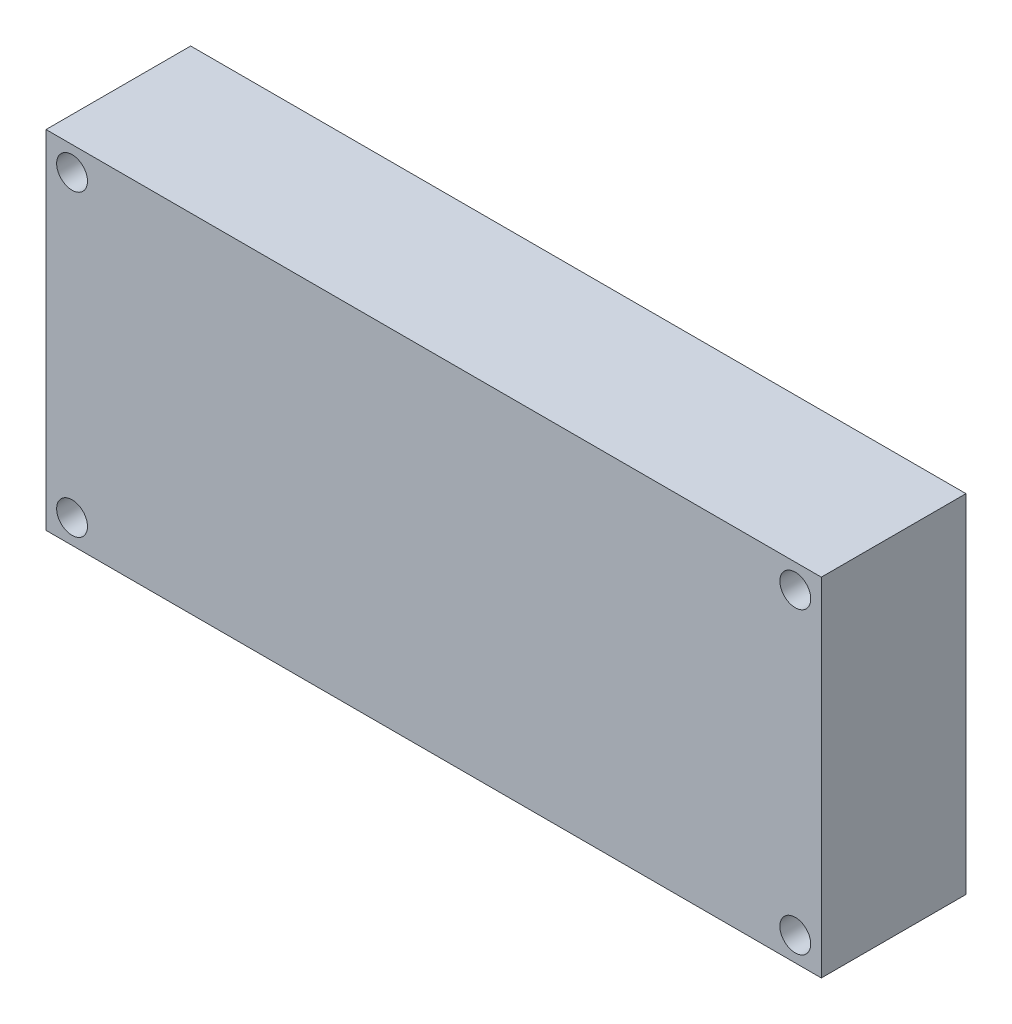
ISO-10303-21;
HEADER;
FILE_DESCRIPTION(('STEP AP214'),'2;1');
FILE_NAME('part.step','',(''),(''),'','','');
FILE_SCHEMA(('AUTOMOTIVE_DESIGN { 1 0 10303 214 1 1 1 1 }'));
ENDSEC;
DATA;
#1=APPLICATION_CONTEXT('core data for automotive mechanical design processes');
#2=APPLICATION_PROTOCOL_DEFINITION('international standard','automotive_design',2000,#1);
#3=PRODUCT_CONTEXT('',#1,'mechanical');
#4=PRODUCT('Part','Part','',(#3));
#5=PRODUCT_RELATED_PRODUCT_CATEGORY('part','',(#4));
#6=PRODUCT_DEFINITION_FORMATION('','',#4);
#7=PRODUCT_DEFINITION_CONTEXT('part definition',#1,'design');
#8=PRODUCT_DEFINITION('design','',#6,#7);
#9=PRODUCT_DEFINITION_SHAPE('','',#8);
#10=(LENGTH_UNIT() NAMED_UNIT(*) SI_UNIT(.MILLI.,.METRE.));
#11=(NAMED_UNIT(*) PLANE_ANGLE_UNIT() SI_UNIT($,.RADIAN.));
#12=(NAMED_UNIT(*) SI_UNIT($,.STERADIAN.) SOLID_ANGLE_UNIT());
#13=UNCERTAINTY_MEASURE_WITH_UNIT(LENGTH_MEASURE(1.E-05),#10,'distance_accuracy_value','');
#14=(GEOMETRIC_REPRESENTATION_CONTEXT(3) GLOBAL_UNCERTAINTY_ASSIGNED_CONTEXT((#13)) GLOBAL_UNIT_ASSIGNED_CONTEXT((#10,
#11,#12)) REPRESENTATION_CONTEXT('',''));
#15=CARTESIAN_POINT('',(0.,0.,0.));
#16=DIRECTION('',(0.,0.,1.));
#17=DIRECTION('',(1.,0.,0.));
#18=AXIS2_PLACEMENT_3D('',#15,#16,#17);
#19=CARTESIAN_POINT('',(40.2,-18.,15.));
#20=DIRECTION('',(0.,0.,1.));
#21=DIRECTION('',(1.,0.,0.));
#22=AXIS2_PLACEMENT_3D('',#19,#20,#21);
#23=PLANE('',#22);
#24=CARTESIAN_POINT('',(37.5,-15.5,15.));
#25=DIRECTION('',(0.,0.,1.));
#26=DIRECTION('',(1.,0.,0.));
#27=AXIS2_PLACEMENT_3D('',#24,#25,#26);
#28=CIRCLE('',#27,1.6);
#29=CARTESIAN_POINT('',(39.1,-15.5,15.));
#30=VERTEX_POINT('',#29);
#31=EDGE_CURVE('E119',#30,#30,#28,.T.);
#32=ORIENTED_EDGE('',*,*,#31,.F.);
#33=EDGE_LOOP('',(#32));
#34=FACE_BOUND('',#33,.T.);
#35=CARTESIAN_POINT('',(-37.5,15.5,15.));
#36=DIRECTION('',(0.,0.,1.));
#37=DIRECTION('',(1.,0.,0.));
#38=AXIS2_PLACEMENT_3D('',#35,#36,#37);
#39=CIRCLE('',#38,1.6);
#40=CARTESIAN_POINT('',(-35.9,15.5,15.));
#41=VERTEX_POINT('',#40);
#42=EDGE_CURVE('E98',#41,#41,#39,.T.);
#43=ORIENTED_EDGE('',*,*,#42,.F.);
#44=EDGE_LOOP('',(#43));
#45=FACE_BOUND('',#44,.T.);
#46=DIRECTION('',(0.,1.,0.));
#47=VECTOR('',#46,1.);
#48=CARTESIAN_POINT('',(40.2,18.,15.));
#49=LINE('',#48,#47);
#50=CARTESIAN_POINT('',(40.2,-18.,15.));
#51=VERTEX_POINT('',#50);
#52=CARTESIAN_POINT('',(40.2,18.,15.));
#53=VERTEX_POINT('',#52);
#54=EDGE_CURVE('E83',#51,#53,#49,.T.);
#55=ORIENTED_EDGE('',*,*,#54,.T.);
#56=DIRECTION('',(-1.,0.,0.));
#57=VECTOR('',#56,1.);
#58=CARTESIAN_POINT('',(-40.2,18.,15.));
#59=LINE('',#58,#57);
#60=CARTESIAN_POINT('',(-40.2,18.,15.));
#61=VERTEX_POINT('',#60);
#62=EDGE_CURVE('E78',#53,#61,#59,.T.);
#63=ORIENTED_EDGE('',*,*,#62,.T.);
#64=DIRECTION('',(0.,-1.,0.));
#65=VECTOR('',#64,1.);
#66=CARTESIAN_POINT('',(-40.2,18.,15.));
#67=LINE('',#66,#65);
#68=CARTESIAN_POINT('',(-40.2,-18.,15.));
#69=VERTEX_POINT('',#68);
#70=EDGE_CURVE('E81',#61,#69,#67,.T.);
#71=ORIENTED_EDGE('',*,*,#70,.T.);
#72=DIRECTION('',(1.,0.,0.));
#73=VECTOR('',#72,1.);
#74=CARTESIAN_POINT('',(-40.2,-18.,15.));
#75=LINE('',#74,#73);
#76=EDGE_CURVE('E48',#69,#51,#75,.T.);
#77=ORIENTED_EDGE('',*,*,#76,.T.);
#78=EDGE_LOOP('',(#55,#63,#71,#77));
#79=FACE_BOUND('',#78,.T.);
#80=CARTESIAN_POINT('',(-37.5,-15.5,15.));
#81=DIRECTION('',(0.,0.,1.));
#82=DIRECTION('',(1.,0.,0.));
#83=AXIS2_PLACEMENT_3D('',#80,#81,#82);
#84=CIRCLE('',#83,1.6);
#85=CARTESIAN_POINT('',(-35.9,-15.5,15.));
#86=VERTEX_POINT('',#85);
#87=EDGE_CURVE('E113',#86,#86,#84,.T.);
#88=ORIENTED_EDGE('',*,*,#87,.F.);
#89=EDGE_LOOP('',(#88));
#90=FACE_BOUND('',#89,.T.);
#91=CARTESIAN_POINT('',(37.5,15.5,15.));
#92=DIRECTION('',(0.,0.,1.));
#93=DIRECTION('',(1.,0.,0.));
#94=AXIS2_PLACEMENT_3D('',#91,#92,#93);
#95=CIRCLE('',#94,1.6);
#96=CARTESIAN_POINT('',(39.1,15.5,15.));
#97=VERTEX_POINT('',#96);
#98=EDGE_CURVE('E125',#97,#97,#95,.T.);
#99=ORIENTED_EDGE('',*,*,#98,.F.);
#100=EDGE_LOOP('',(#99));
#101=FACE_BOUND('',#100,.T.);
#102=ADVANCED_FACE('F31',(#34,#45,#79,#90,#101),#23,.T.);
#103=CARTESIAN_POINT('',(40.2,-18.,0.));
#104=DIRECTION('',(0.,0.,1.));
#105=DIRECTION('',(1.,0.,0.));
#106=AXIS2_PLACEMENT_3D('',#103,#104,#105);
#107=PLANE('',#106);
#108=CARTESIAN_POINT('',(37.5,-15.5,0.));
#109=DIRECTION('',(0.,0.,1.));
#110=DIRECTION('',(1.,0.,0.));
#111=AXIS2_PLACEMENT_3D('',#108,#109,#110);
#112=CIRCLE('',#111,1.6);
#113=CARTESIAN_POINT('',(39.1,-15.5,0.));
#114=VERTEX_POINT('',#113);
#115=EDGE_CURVE('E122',#114,#114,#112,.T.);
#116=ORIENTED_EDGE('',*,*,#115,.T.);
#117=EDGE_LOOP('',(#116));
#118=FACE_BOUND('',#117,.T.);
#119=CARTESIAN_POINT('',(-37.5,15.5,0.));
#120=DIRECTION('',(0.,0.,1.));
#121=DIRECTION('',(1.,0.,0.));
#122=AXIS2_PLACEMENT_3D('',#119,#120,#121);
#123=CIRCLE('',#122,1.6);
#124=CARTESIAN_POINT('',(-35.9,15.5,0.));
#125=VERTEX_POINT('',#124);
#126=EDGE_CURVE('E110',#125,#125,#123,.T.);
#127=ORIENTED_EDGE('',*,*,#126,.T.);
#128=EDGE_LOOP('',(#127));
#129=FACE_BOUND('',#128,.T.);
#130=DIRECTION('',(0.,1.,0.));
#131=VECTOR('',#130,1.);
#132=CARTESIAN_POINT('',(40.2,18.,0.));
#133=LINE('',#132,#131);
#134=CARTESIAN_POINT('',(40.2,-18.,0.));
#135=VERTEX_POINT('',#134);
#136=CARTESIAN_POINT('',(40.2,18.,0.));
#137=VERTEX_POINT('',#136);
#138=EDGE_CURVE('E95',#135,#137,#133,.T.);
#139=ORIENTED_EDGE('',*,*,#138,.F.);
#140=DIRECTION('',(1.,0.,0.));
#141=VECTOR('',#140,1.);
#142=CARTESIAN_POINT('',(-40.2,-18.,0.));
#143=LINE('',#142,#141);
#144=CARTESIAN_POINT('',(-40.2,-18.,0.));
#145=VERTEX_POINT('',#144);
#146=EDGE_CURVE('E71',#145,#135,#143,.T.);
#147=ORIENTED_EDGE('',*,*,#146,.F.);
#148=DIRECTION('',(0.,-1.,0.));
#149=VECTOR('',#148,1.);
#150=CARTESIAN_POINT('',(-40.2,18.,0.));
#151=LINE('',#150,#149);
#152=CARTESIAN_POINT('',(-40.2,18.,0.));
#153=VERTEX_POINT('',#152);
#154=EDGE_CURVE('E65',#153,#145,#151,.T.);
#155=ORIENTED_EDGE('',*,*,#154,.F.);
#156=DIRECTION('',(-1.,0.,0.));
#157=VECTOR('',#156,1.);
#158=CARTESIAN_POINT('',(-40.2,18.,0.));
#159=LINE('',#158,#157);
#160=EDGE_CURVE('E87',#137,#153,#159,.T.);
#161=ORIENTED_EDGE('',*,*,#160,.F.);
#162=EDGE_LOOP('',(#139,#147,#155,#161));
#163=FACE_BOUND('',#162,.T.);
#164=CARTESIAN_POINT('',(-37.5,-15.5,0.));
#165=DIRECTION('',(0.,0.,1.));
#166=DIRECTION('',(1.,0.,0.));
#167=AXIS2_PLACEMENT_3D('',#164,#165,#166);
#168=CIRCLE('',#167,1.6);
#169=CARTESIAN_POINT('',(-35.9,-15.5,0.));
#170=VERTEX_POINT('',#169);
#171=EDGE_CURVE('E116',#170,#170,#168,.T.);
#172=ORIENTED_EDGE('',*,*,#171,.T.);
#173=EDGE_LOOP('',(#172));
#174=FACE_BOUND('',#173,.T.);
#175=CARTESIAN_POINT('',(37.5,15.5,0.));
#176=DIRECTION('',(0.,0.,1.));
#177=DIRECTION('',(1.,0.,0.));
#178=AXIS2_PLACEMENT_3D('',#175,#176,#177);
#179=CIRCLE('',#178,1.6);
#180=CARTESIAN_POINT('',(39.1,15.5,0.));
#181=VERTEX_POINT('',#180);
#182=EDGE_CURVE('E128',#181,#181,#179,.T.);
#183=ORIENTED_EDGE('',*,*,#182,.T.);
#184=EDGE_LOOP('',(#183));
#185=FACE_BOUND('',#184,.T.);
#186=ADVANCED_FACE('F106',(#118,#129,#163,#174,#185),#107,.F.);
#187=CARTESIAN_POINT('',(40.2,18.,15.));
#188=DIRECTION('',(-1.,0.,0.));
#189=DIRECTION('',(0.,0.,1.));
#190=AXIS2_PLACEMENT_3D('',#187,#188,#189);
#191=PLANE('',#190);
#192=ORIENTED_EDGE('',*,*,#138,.T.);
#193=DIRECTION('',(0.,0.,-1.));
#194=VECTOR('',#193,1.);
#195=CARTESIAN_POINT('',(40.2,18.,15.));
#196=LINE('',#195,#194);
#197=EDGE_CURVE('E11',#53,#137,#196,.T.);
#198=ORIENTED_EDGE('',*,*,#197,.F.);
#199=ORIENTED_EDGE('',*,*,#54,.F.);
#200=DIRECTION('',(0.,0.,-1.));
#201=VECTOR('',#200,1.);
#202=CARTESIAN_POINT('',(40.2,-18.,15.));
#203=LINE('',#202,#201);
#204=EDGE_CURVE('E91',#51,#135,#203,.T.);
#205=ORIENTED_EDGE('',*,*,#204,.T.);
#206=EDGE_LOOP('',(#192,#198,#199,#205));
#207=FACE_BOUND('',#206,.T.);
#208=ADVANCED_FACE('F33',(#207),#191,.F.);
#209=CARTESIAN_POINT('',(-40.2,18.,15.));
#210=DIRECTION('',(0.,-1.,0.));
#211=DIRECTION('',(0.,0.,-1.));
#212=AXIS2_PLACEMENT_3D('',#209,#210,#211);
#213=PLANE('',#212);
#214=ORIENTED_EDGE('',*,*,#160,.T.);
#215=DIRECTION('',(0.,0.,-1.));
#216=VECTOR('',#215,1.);
#217=CARTESIAN_POINT('',(-40.2,18.,15.));
#218=LINE('',#217,#216);
#219=EDGE_CURVE('E40',#61,#153,#218,.T.);
#220=ORIENTED_EDGE('',*,*,#219,.F.);
#221=ORIENTED_EDGE('',*,*,#62,.F.);
#222=ORIENTED_EDGE('',*,*,#197,.T.);
#223=EDGE_LOOP('',(#214,#220,#221,#222));
#224=FACE_BOUND('',#223,.T.);
#225=ADVANCED_FACE('F86',(#224),#213,.F.);
#226=CARTESIAN_POINT('',(-40.2,18.,15.));
#227=DIRECTION('',(1.,0.,0.));
#228=DIRECTION('',(0.,1.,0.));
#229=AXIS2_PLACEMENT_3D('',#226,#227,#228);
#230=PLANE('',#229);
#231=ORIENTED_EDGE('',*,*,#154,.T.);
#232=DIRECTION('',(0.,0.,-1.));
#233=VECTOR('',#232,1.);
#234=CARTESIAN_POINT('',(-40.2,-18.,15.));
#235=LINE('',#234,#233);
#236=EDGE_CURVE('E88',#69,#145,#235,.T.);
#237=ORIENTED_EDGE('',*,*,#236,.F.);
#238=ORIENTED_EDGE('',*,*,#70,.F.);
#239=ORIENTED_EDGE('',*,*,#219,.T.);
#240=EDGE_LOOP('',(#231,#237,#238,#239));
#241=FACE_BOUND('',#240,.T.);
#242=ADVANCED_FACE('F89',(#241),#230,.F.);
#243=CARTESIAN_POINT('',(-40.2,-18.,15.));
#244=DIRECTION('',(0.,1.,0.));
#245=DIRECTION('',(0.,0.,1.));
#246=AXIS2_PLACEMENT_3D('',#243,#244,#245);
#247=PLANE('',#246);
#248=ORIENTED_EDGE('',*,*,#146,.T.);
#249=ORIENTED_EDGE('',*,*,#204,.F.);
#250=ORIENTED_EDGE('',*,*,#76,.F.);
#251=ORIENTED_EDGE('',*,*,#236,.T.);
#252=EDGE_LOOP('',(#248,#249,#250,#251));
#253=FACE_BOUND('',#252,.T.);
#254=ADVANCED_FACE('F103',(#253),#247,.F.);
#255=CARTESIAN_POINT('',(-37.5,15.5,15.));
#256=DIRECTION('',(0.,0.,-1.));
#257=DIRECTION('',(-1.,0.,0.));
#258=AXIS2_PLACEMENT_3D('',#255,#256,#257);
#259=CYLINDRICAL_SURFACE('',#258,1.6);
#260=ORIENTED_EDGE('',*,*,#42,.T.);
#261=EDGE_LOOP('',(#260));
#262=FACE_BOUND('',#261,.T.);
#263=ORIENTED_EDGE('',*,*,#126,.F.);
#264=EDGE_LOOP('',(#263));
#265=FACE_BOUND('',#264,.T.);
#266=ADVANCED_FACE('F148',(#262,#265),#259,.F.);
#267=CARTESIAN_POINT('',(-37.5,-15.5,15.));
#268=DIRECTION('',(0.,0.,-1.));
#269=DIRECTION('',(-1.,0.,0.));
#270=AXIS2_PLACEMENT_3D('',#267,#268,#269);
#271=CYLINDRICAL_SURFACE('',#270,1.6);
#272=ORIENTED_EDGE('',*,*,#87,.T.);
#273=EDGE_LOOP('',(#272));
#274=FACE_BOUND('',#273,.T.);
#275=ORIENTED_EDGE('',*,*,#171,.F.);
#276=EDGE_LOOP('',(#275));
#277=FACE_BOUND('',#276,.T.);
#278=ADVANCED_FACE('F194',(#274,#277),#271,.F.);
#279=CARTESIAN_POINT('',(37.5,-15.5,15.));
#280=DIRECTION('',(0.,0.,-1.));
#281=DIRECTION('',(-1.,0.,0.));
#282=AXIS2_PLACEMENT_3D('',#279,#280,#281);
#283=CYLINDRICAL_SURFACE('',#282,1.6);
#284=ORIENTED_EDGE('',*,*,#31,.T.);
#285=EDGE_LOOP('',(#284));
#286=FACE_BOUND('',#285,.T.);
#287=ORIENTED_EDGE('',*,*,#115,.F.);
#288=EDGE_LOOP('',(#287));
#289=FACE_BOUND('',#288,.T.);
#290=ADVANCED_FACE('F202',(#286,#289),#283,.F.);
#291=CARTESIAN_POINT('',(37.5,15.5,15.));
#292=DIRECTION('',(0.,0.,-1.));
#293=DIRECTION('',(-1.,0.,0.));
#294=AXIS2_PLACEMENT_3D('',#291,#292,#293);
#295=CYLINDRICAL_SURFACE('',#294,1.6);
#296=ORIENTED_EDGE('',*,*,#98,.T.);
#297=EDGE_LOOP('',(#296));
#298=FACE_BOUND('',#297,.T.);
#299=ORIENTED_EDGE('',*,*,#182,.F.);
#300=EDGE_LOOP('',(#299));
#301=FACE_BOUND('',#300,.T.);
#302=ADVANCED_FACE('F134',(#298,#301),#295,.F.);
#303=CLOSED_SHELL('',(#102,#186,#208,#225,#242,#254,#266,#278,#290,#302));
#304=MANIFOLD_SOLID_BREP('B2',#303);
#305=ADVANCED_BREP_SHAPE_REPRESENTATION('',(#18,#304),#14);
#306=SHAPE_DEFINITION_REPRESENTATION(#9,#305);
ENDSEC;
END-ISO-10303-21;
